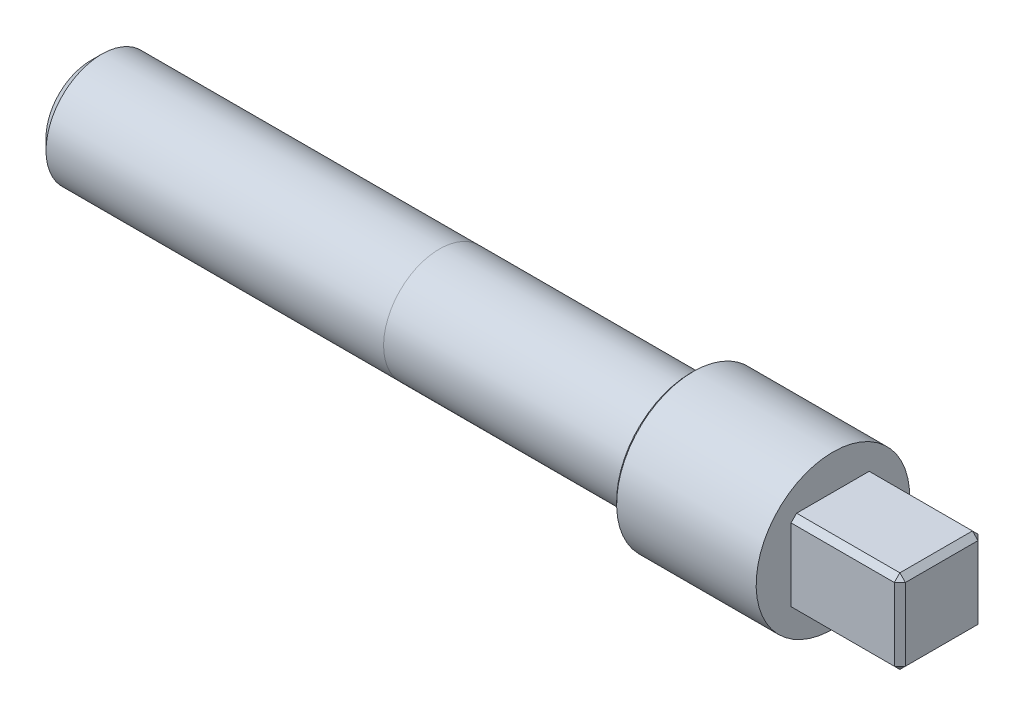
ISO-10303-21;
HEADER;
FILE_DESCRIPTION(('STEP AP214'),'2;1');
FILE_NAME('part.step','',(''),(''),'','','');
FILE_SCHEMA(('AUTOMOTIVE_DESIGN { 1 0 10303 214 1 1 1 1 }'));
ENDSEC;
DATA;
#1=APPLICATION_CONTEXT('core data for automotive mechanical design processes');
#2=APPLICATION_PROTOCOL_DEFINITION('international standard','automotive_design',2000,#1);
#3=PRODUCT_CONTEXT('',#1,'mechanical');
#4=PRODUCT('Part','Part','',(#3));
#5=PRODUCT_RELATED_PRODUCT_CATEGORY('part','',(#4));
#6=PRODUCT_DEFINITION_FORMATION('','',#4);
#7=PRODUCT_DEFINITION_CONTEXT('part definition',#1,'design');
#8=PRODUCT_DEFINITION('design','',#6,#7);
#9=PRODUCT_DEFINITION_SHAPE('','',#8);
#10=(LENGTH_UNIT() NAMED_UNIT(*) SI_UNIT(.MILLI.,.METRE.));
#11=(NAMED_UNIT(*) PLANE_ANGLE_UNIT() SI_UNIT($,.RADIAN.));
#12=(NAMED_UNIT(*) SI_UNIT($,.STERADIAN.) SOLID_ANGLE_UNIT());
#13=UNCERTAINTY_MEASURE_WITH_UNIT(LENGTH_MEASURE(1.E-05),#10,'distance_accuracy_value','');
#14=(GEOMETRIC_REPRESENTATION_CONTEXT(3) GLOBAL_UNCERTAINTY_ASSIGNED_CONTEXT((#13)) GLOBAL_UNIT_ASSIGNED_CONTEXT((#10,
#11,#12)) REPRESENTATION_CONTEXT('',''));
#15=CARTESIAN_POINT('',(0.,0.,0.));
#16=DIRECTION('',(0.,0.,1.));
#17=DIRECTION('',(1.,0.,0.));
#18=AXIS2_PLACEMENT_3D('',#15,#16,#17);
#19=CARTESIAN_POINT('',(215.,0.,0.));
#20=DIRECTION('',(-1.,0.,0.));
#21=DIRECTION('',(0.,0.,1.));
#22=AXIS2_PLACEMENT_3D('',#19,#20,#21);
#23=CYLINDRICAL_SURFACE('',#22,20.);
#24=CARTESIAN_POINT('',(215.,0.,0.));
#25=DIRECTION('',(1.,0.,0.));
#26=DIRECTION('',(0.,0.,-1.));
#27=AXIS2_PLACEMENT_3D('',#24,#25,#26);
#28=CIRCLE('',#27,20.);
#29=CARTESIAN_POINT('',(215.,0.,-20.));
#30=VERTEX_POINT('',#29);
#31=EDGE_CURVE('E145',#30,#30,#28,.T.);
#32=ORIENTED_EDGE('',*,*,#31,.F.);
#33=EDGE_LOOP('',(#32));
#34=FACE_BOUND('',#33,.T.);
#35=CARTESIAN_POINT('',(125.,0.,0.));
#36=DIRECTION('',(-1.,0.,0.));
#37=DIRECTION('',(0.,-1.,0.));
#38=AXIS2_PLACEMENT_3D('',#35,#36,#37);
#39=CIRCLE('',#38,20.);
#40=CARTESIAN_POINT('',(125.,-20.,0.));
#41=VERTEX_POINT('',#40);
#42=EDGE_CURVE('E191',#41,#41,#39,.T.);
#43=ORIENTED_EDGE('',*,*,#42,.F.);
#44=EDGE_LOOP('',(#43));
#45=FACE_BOUND('',#44,.T.);
#46=ADVANCED_FACE('F36',(#34,#45),#23,.T.);
#47=CARTESIAN_POINT('',(266.,0.,0.));
#48=DIRECTION('',(1.,0.,0.));
#49=DIRECTION('',(0.,1.,0.));
#50=AXIS2_PLACEMENT_3D('',#47,#48,#49);
#51=PLANE('',#50);
#52=CARTESIAN_POINT('',(266.,0.,0.));
#53=DIRECTION('',(1.,0.,0.));
#54=DIRECTION('',(0.,1.,0.));
#55=AXIS2_PLACEMENT_3D('',#52,#53,#54);
#56=CIRCLE('',#55,27.5);
#57=CARTESIAN_POINT('',(266.,27.5,0.));
#58=VERTEX_POINT('',#57);
#59=EDGE_CURVE('E141',#58,#58,#56,.T.);
#60=ORIENTED_EDGE('',*,*,#59,.T.);
#61=EDGE_LOOP('',(#60));
#62=FACE_BOUND('',#61,.T.);
#63=DIRECTION('',(0.,-1.,0.));
#64=VECTOR('',#63,1.);
#65=CARTESIAN_POINT('',(266.,15.,14.9999999999999));
#66=LINE('',#65,#64);
#67=CARTESIAN_POINT('',(266.,13.,14.9999999999999));
#68=VERTEX_POINT('',#67);
#69=CARTESIAN_POINT('',(266.,-13.,14.9999999999999));
#70=VERTEX_POINT('',#69);
#71=EDGE_CURVE('E147',#68,#70,#66,.T.);
#72=ORIENTED_EDGE('',*,*,#71,.F.);
#73=DIRECTION('',(0.,-0.707106781186548,0.707106781186548));
#74=VECTOR('',#73,1.);
#75=CARTESIAN_POINT('',(266.,13.,14.9999999999999));
#76=LINE('',#75,#74);
#77=CARTESIAN_POINT('',(266.,15.,12.9999999999999));
#78=VERTEX_POINT('',#77);
#79=EDGE_CURVE('E186',#68,#78,#76,.F.);
#80=ORIENTED_EDGE('',*,*,#79,.T.);
#81=DIRECTION('',(0.,0.,1.));
#82=VECTOR('',#81,1.);
#83=CARTESIAN_POINT('',(266.,15.,-15.0000000000001));
#84=LINE('',#83,#82);
#85=CARTESIAN_POINT('',(266.,15.,-13.0000000000001));
#86=VERTEX_POINT('',#85);
#87=EDGE_CURVE('E222',#86,#78,#84,.T.);
#88=ORIENTED_EDGE('',*,*,#87,.F.);
#89=DIRECTION('',(0.,0.707106781186548,0.707106781186548));
#90=VECTOR('',#89,1.);
#91=CARTESIAN_POINT('',(266.,15.,-13.0000000000001));
#92=LINE('',#91,#90);
#93=CARTESIAN_POINT('',(266.,13.,-15.0000000000001));
#94=VERTEX_POINT('',#93);
#95=EDGE_CURVE('E140',#86,#94,#92,.F.);
#96=ORIENTED_EDGE('',*,*,#95,.T.);
#97=DIRECTION('',(0.,1.,0.));
#98=VECTOR('',#97,1.);
#99=CARTESIAN_POINT('',(266.,15.,-15.0000000000001));
#100=LINE('',#99,#98);
#101=CARTESIAN_POINT('',(266.,-13.,-15.0000000000001));
#102=VERTEX_POINT('',#101);
#103=EDGE_CURVE('E129',#102,#94,#100,.T.);
#104=ORIENTED_EDGE('',*,*,#103,.F.);
#105=DIRECTION('',(0.,0.707106781186548,-0.707106781186548));
#106=VECTOR('',#105,1.);
#107=CARTESIAN_POINT('',(266.,-13.,-15.0000000000001));
#108=LINE('',#107,#106);
#109=CARTESIAN_POINT('',(266.,-15.,-13.0000000000001));
#110=VERTEX_POINT('',#109);
#111=EDGE_CURVE('E113',#102,#110,#108,.F.);
#112=ORIENTED_EDGE('',*,*,#111,.T.);
#113=DIRECTION('',(0.,0.,-1.));
#114=VECTOR('',#113,1.);
#115=CARTESIAN_POINT('',(266.,-15.,-15.0000000000001));
#116=LINE('',#115,#114);
#117=CARTESIAN_POINT('',(266.,-15.,12.9999999999999));
#118=VERTEX_POINT('',#117);
#119=EDGE_CURVE('E142',#118,#110,#116,.T.);
#120=ORIENTED_EDGE('',*,*,#119,.F.);
#121=DIRECTION('',(0.,-0.707106781186548,-0.707106781186547));
#122=VECTOR('',#121,1.);
#123=CARTESIAN_POINT('',(266.,-15.,12.9999999999999));
#124=LINE('',#123,#122);
#125=EDGE_CURVE('E123',#118,#70,#124,.F.);
#126=ORIENTED_EDGE('',*,*,#125,.T.);
#127=EDGE_LOOP('',(#72,#80,#88,#96,#104,#112,#120,#126));
#128=FACE_BOUND('',#127,.T.);
#129=ADVANCED_FACE('F137',(#62,#128),#51,.T.);
#130=CARTESIAN_POINT('',(215.,0.,0.));
#131=DIRECTION('',(1.,0.,0.));
#132=DIRECTION('',(0.,1.,0.));
#133=AXIS2_PLACEMENT_3D('',#130,#131,#132);
#134=PLANE('',#133);
#135=CARTESIAN_POINT('',(215.,0.,0.));
#136=DIRECTION('',(1.,0.,0.));
#137=DIRECTION('',(0.,1.,0.));
#138=AXIS2_PLACEMENT_3D('',#135,#136,#137);
#139=CIRCLE('',#138,26.5);
#140=CARTESIAN_POINT('',(215.,26.5,0.));
#141=VERTEX_POINT('',#140);
#142=EDGE_CURVE('E156',#141,#141,#139,.F.);
#143=ORIENTED_EDGE('',*,*,#142,.T.);
#144=EDGE_LOOP('',(#143));
#145=FACE_BOUND('',#144,.T.);
#146=ORIENTED_EDGE('',*,*,#31,.T.);
#147=EDGE_LOOP('',(#146));
#148=FACE_BOUND('',#147,.T.);
#149=ADVANCED_FACE('F242',(#145,#148),#134,.F.);
#150=CARTESIAN_POINT('',(266.,0.,0.));
#151=DIRECTION('',(-1.,0.,0.));
#152=DIRECTION('',(0.,-1.,0.));
#153=AXIS2_PLACEMENT_3D('',#150,#151,#152);
#154=CYLINDRICAL_SURFACE('',#153,27.5);
#155=CARTESIAN_POINT('',(216.,0.,0.));
#156=DIRECTION('',(1.,0.,0.));
#157=DIRECTION('',(0.,1.,0.));
#158=AXIS2_PLACEMENT_3D('',#155,#156,#157);
#159=CIRCLE('',#158,27.5);
#160=CARTESIAN_POINT('',(216.,27.5,0.));
#161=VERTEX_POINT('',#160);
#162=EDGE_CURVE('E153',#161,#161,#159,.T.);
#163=ORIENTED_EDGE('',*,*,#162,.T.);
#164=EDGE_LOOP('',(#163));
#165=FACE_BOUND('',#164,.T.);
#166=ORIENTED_EDGE('',*,*,#59,.F.);
#167=EDGE_LOOP('',(#166));
#168=FACE_BOUND('',#167,.T.);
#169=ADVANCED_FACE('F345',(#165,#168),#154,.T.);
#170=CARTESIAN_POINT('',(305.,15.,-15.0000000000001));
#171=DIRECTION('',(0.,-1.,0.));
#172=DIRECTION('',(1.,0.,0.));
#173=AXIS2_PLACEMENT_3D('',#170,#171,#172);
#174=PLANE('',#173);
#175=DIRECTION('',(0.,0.,-1.));
#176=VECTOR('',#175,1.);
#177=CARTESIAN_POINT('',(303.,15.,-15.0000000000001));
#178=LINE('',#177,#176);
#179=CARTESIAN_POINT('',(303.,15.,12.9999999999999));
#180=VERTEX_POINT('',#179);
#181=CARTESIAN_POINT('',(303.,15.,-13.0000000000001));
#182=VERTEX_POINT('',#181);
#183=EDGE_CURVE('E51',#180,#182,#178,.T.);
#184=ORIENTED_EDGE('',*,*,#183,.T.);
#185=DIRECTION('',(-1.,0.,0.));
#186=VECTOR('',#185,1.);
#187=CARTESIAN_POINT('',(305.,15.,-13.0000000000001));
#188=LINE('',#187,#186);
#189=EDGE_CURVE('E124',#182,#86,#188,.T.);
#190=ORIENTED_EDGE('',*,*,#189,.T.);
#191=ORIENTED_EDGE('',*,*,#87,.T.);
#192=DIRECTION('',(1.,0.,0.));
#193=VECTOR('',#192,1.);
#194=CARTESIAN_POINT('',(305.,15.,12.9999999999999));
#195=LINE('',#194,#193);
#196=EDGE_CURVE('E56',#78,#180,#195,.T.);
#197=ORIENTED_EDGE('',*,*,#196,.T.);
#198=EDGE_LOOP('',(#184,#190,#191,#197));
#199=FACE_BOUND('',#198,.T.);
#200=ADVANCED_FACE('F310',(#199),#174,.F.);
#201=CARTESIAN_POINT('',(305.,15.,14.9999999999999));
#202=DIRECTION('',(0.,0.,-1.));
#203=DIRECTION('',(-1.,0.,0.));
#204=AXIS2_PLACEMENT_3D('',#201,#202,#203);
#205=PLANE('',#204);
#206=ORIENTED_EDGE('',*,*,#71,.T.);
#207=DIRECTION('',(1.,0.,0.));
#208=VECTOR('',#207,1.);
#209=CARTESIAN_POINT('',(305.,-13.,14.9999999999999));
#210=LINE('',#209,#208);
#211=CARTESIAN_POINT('',(303.,-13.,14.9999999999999));
#212=VERTEX_POINT('',#211);
#213=EDGE_CURVE('E170',#70,#212,#210,.T.);
#214=ORIENTED_EDGE('',*,*,#213,.T.);
#215=DIRECTION('',(0.,1.,0.));
#216=VECTOR('',#215,1.);
#217=CARTESIAN_POINT('',(303.,15.,14.9999999999999));
#218=LINE('',#217,#216);
#219=CARTESIAN_POINT('',(303.,13.,14.9999999999999));
#220=VERTEX_POINT('',#219);
#221=EDGE_CURVE('E166',#212,#220,#218,.T.);
#222=ORIENTED_EDGE('',*,*,#221,.T.);
#223=DIRECTION('',(-1.,0.,0.));
#224=VECTOR('',#223,1.);
#225=CARTESIAN_POINT('',(305.,13.,14.9999999999999));
#226=LINE('',#225,#224);
#227=EDGE_CURVE('E168',#220,#68,#226,.T.);
#228=ORIENTED_EDGE('',*,*,#227,.T.);
#229=EDGE_LOOP('',(#206,#214,#222,#228));
#230=FACE_BOUND('',#229,.T.);
#231=ADVANCED_FACE('F339',(#230),#205,.F.);
#232=CARTESIAN_POINT('',(305.,-15.,-15.0000000000001));
#233=DIRECTION('',(0.,1.,0.));
#234=DIRECTION('',(-1.,0.,0.));
#235=AXIS2_PLACEMENT_3D('',#232,#233,#234);
#236=PLANE('',#235);
#237=ORIENTED_EDGE('',*,*,#119,.T.);
#238=DIRECTION('',(1.,0.,0.));
#239=VECTOR('',#238,1.);
#240=CARTESIAN_POINT('',(305.,-15.,-13.0000000000001));
#241=LINE('',#240,#239);
#242=CARTESIAN_POINT('',(303.,-15.,-13.0000000000001));
#243=VERTEX_POINT('',#242);
#244=EDGE_CURVE('E118',#110,#243,#241,.T.);
#245=ORIENTED_EDGE('',*,*,#244,.T.);
#246=DIRECTION('',(0.,0.,1.));
#247=VECTOR('',#246,1.);
#248=CARTESIAN_POINT('',(303.,-15.,14.9999999999999));
#249=LINE('',#248,#247);
#250=CARTESIAN_POINT('',(303.,-15.,12.9999999999999));
#251=VERTEX_POINT('',#250);
#252=EDGE_CURVE('E134',#243,#251,#249,.T.);
#253=ORIENTED_EDGE('',*,*,#252,.T.);
#254=DIRECTION('',(-1.,0.,0.));
#255=VECTOR('',#254,1.);
#256=CARTESIAN_POINT('',(305.,-15.,12.9999999999999));
#257=LINE('',#256,#255);
#258=EDGE_CURVE('E163',#251,#118,#257,.T.);
#259=ORIENTED_EDGE('',*,*,#258,.T.);
#260=EDGE_LOOP('',(#237,#245,#253,#259));
#261=FACE_BOUND('',#260,.T.);
#262=ADVANCED_FACE('F336',(#261),#236,.F.);
#263=CARTESIAN_POINT('',(305.,15.,-15.0000000000001));
#264=DIRECTION('',(0.,0.,1.));
#265=DIRECTION('',(1.,0.,0.));
#266=AXIS2_PLACEMENT_3D('',#263,#264,#265);
#267=PLANE('',#266);
#268=DIRECTION('',(0.,-1.,0.));
#269=VECTOR('',#268,1.);
#270=CARTESIAN_POINT('',(303.,-15.,-15.0000000000001));
#271=LINE('',#270,#269);
#272=CARTESIAN_POINT('',(303.,13.,-15.0000000000001));
#273=VERTEX_POINT('',#272);
#274=CARTESIAN_POINT('',(303.,-13.,-15.0000000000001));
#275=VERTEX_POINT('',#274);
#276=EDGE_CURVE('E132',#273,#275,#271,.T.);
#277=ORIENTED_EDGE('',*,*,#276,.T.);
#278=DIRECTION('',(-1.,0.,0.));
#279=VECTOR('',#278,1.);
#280=CARTESIAN_POINT('',(305.,-13.,-15.0000000000001));
#281=LINE('',#280,#279);
#282=EDGE_CURVE('E117',#275,#102,#281,.T.);
#283=ORIENTED_EDGE('',*,*,#282,.T.);
#284=ORIENTED_EDGE('',*,*,#103,.T.);
#285=DIRECTION('',(1.,0.,0.));
#286=VECTOR('',#285,1.);
#287=CARTESIAN_POINT('',(305.,13.,-15.0000000000001));
#288=LINE('',#287,#286);
#289=EDGE_CURVE('E159',#94,#273,#288,.T.);
#290=ORIENTED_EDGE('',*,*,#289,.T.);
#291=EDGE_LOOP('',(#277,#283,#284,#290));
#292=FACE_BOUND('',#291,.T.);
#293=ADVANCED_FACE('F128',(#292),#267,.F.);
#294=CARTESIAN_POINT('',(305.,0.,0.));
#295=DIRECTION('',(1.,0.,0.));
#296=DIRECTION('',(0.,0.,-1.));
#297=AXIS2_PLACEMENT_3D('',#294,#295,#296);
#298=PLANE('',#297);
#299=DIRECTION('',(0.,-1.,0.));
#300=VECTOR('',#299,1.);
#301=CARTESIAN_POINT('',(305.,-15.,12.9999999999999));
#302=LINE('',#301,#300);
#303=CARTESIAN_POINT('',(305.,13.,12.9999999999999));
#304=VERTEX_POINT('',#303);
#305=CARTESIAN_POINT('',(305.,-13.,12.9999999999999));
#306=VERTEX_POINT('',#305);
#307=EDGE_CURVE('E174',#304,#306,#302,.T.);
#308=ORIENTED_EDGE('',*,*,#307,.T.);
#309=DIRECTION('',(0.,0.,-1.));
#310=VECTOR('',#309,1.);
#311=CARTESIAN_POINT('',(305.,-13.,-15.0000000000001));
#312=LINE('',#311,#310);
#313=CARTESIAN_POINT('',(305.,-13.,-13.0000000000001));
#314=VERTEX_POINT('',#313);
#315=EDGE_CURVE('E178',#306,#314,#312,.T.);
#316=ORIENTED_EDGE('',*,*,#315,.T.);
#317=DIRECTION('',(0.,1.,0.));
#318=VECTOR('',#317,1.);
#319=CARTESIAN_POINT('',(305.,15.,-13.0000000000001));
#320=LINE('',#319,#318);
#321=CARTESIAN_POINT('',(305.,13.,-13.0000000000001));
#322=VERTEX_POINT('',#321);
#323=EDGE_CURVE('E176',#314,#322,#320,.T.);
#324=ORIENTED_EDGE('',*,*,#323,.T.);
#325=DIRECTION('',(0.,0.,1.));
#326=VECTOR('',#325,1.);
#327=CARTESIAN_POINT('',(305.,13.,14.9999999999999));
#328=LINE('',#327,#326);
#329=EDGE_CURVE('E172',#322,#304,#328,.T.);
#330=ORIENTED_EDGE('',*,*,#329,.T.);
#331=EDGE_LOOP('',(#308,#316,#324,#330));
#332=FACE_BOUND('',#331,.T.);
#333=ADVANCED_FACE('F253',(#332),#298,.T.);
#334=CARTESIAN_POINT('',(216.,0.,0.));
#335=DIRECTION('',(1.,0.,0.));
#336=DIRECTION('',(0.,1.,0.));
#337=AXIS2_PLACEMENT_3D('',#334,#335,#336);
#338=CONICAL_SURFACE('',#337,27.5,0.78539816339745);
#339=ORIENTED_EDGE('',*,*,#142,.F.);
#340=EDGE_LOOP('',(#339));
#341=FACE_BOUND('',#340,.T.);
#342=ORIENTED_EDGE('',*,*,#162,.F.);
#343=EDGE_LOOP('',(#342));
#344=FACE_BOUND('',#343,.T.);
#345=ADVANCED_FACE('F249',(#341,#344),#338,.T.);
#346=CARTESIAN_POINT('',(305.,13.,14.9999999999999));
#347=DIRECTION('',(0.,-0.707106781186547,-0.707106781186547));
#348=DIRECTION('',(-1.,0.,0.));
#349=AXIS2_PLACEMENT_3D('',#346,#347,#348);
#350=PLANE('',#349);
#351=DIRECTION('',(0.,0.707106781186547,-0.707106781186547));
#352=VECTOR('',#351,1.);
#353=CARTESIAN_POINT('',(303.,15.,12.9999999999999));
#354=LINE('',#353,#352);
#355=EDGE_CURVE('E220',#180,#220,#354,.F.);
#356=ORIENTED_EDGE('',*,*,#355,.F.);
#357=ORIENTED_EDGE('',*,*,#196,.F.);
#358=ORIENTED_EDGE('',*,*,#79,.F.);
#359=ORIENTED_EDGE('',*,*,#227,.F.);
#360=EDGE_LOOP('',(#356,#357,#358,#359));
#361=FACE_BOUND('',#360,.T.);
#362=ADVANCED_FACE('F252',(#361),#350,.F.);
#363=CARTESIAN_POINT('',(303.,15.,12.9999999999999));
#364=DIRECTION('',(0.577350269189626,0.577350269189626,0.577350269189626));
#365=DIRECTION('',(0.707106781186547,0.,-0.707106781186547));
#366=AXIS2_PLACEMENT_3D('',#363,#364,#365);
#367=PLANE('',#366);
#368=DIRECTION('',(-0.707106781186548,0.707106781186547,0.));
#369=VECTOR('',#368,1.);
#370=CARTESIAN_POINT('',(303.,15.,12.9999999999999));
#371=LINE('',#370,#369);
#372=EDGE_CURVE('E214',#180,#304,#371,.F.);
#373=ORIENTED_EDGE('',*,*,#372,.F.);
#374=ORIENTED_EDGE('',*,*,#355,.T.);
#375=DIRECTION('',(0.707106781186547,0.,-0.707106781186547));
#376=VECTOR('',#375,1.);
#377=CARTESIAN_POINT('',(304.,13.,13.9999999999999));
#378=LINE('',#377,#376);
#379=EDGE_CURVE('E217',#304,#220,#378,.F.);
#380=ORIENTED_EDGE('',*,*,#379,.F.);
#381=EDGE_LOOP('',(#373,#374,#380));
#382=FACE_BOUND('',#381,.T.);
#383=ADVANCED_FACE('F293',(#382),#367,.T.);
#384=CARTESIAN_POINT('',(305.,-15.,12.9999999999999));
#385=DIRECTION('',(0.,0.707106781186547,-0.707106781186548));
#386=DIRECTION('',(-1.,0.,0.));
#387=AXIS2_PLACEMENT_3D('',#384,#385,#386);
#388=PLANE('',#387);
#389=ORIENTED_EDGE('',*,*,#125,.F.);
#390=ORIENTED_EDGE('',*,*,#258,.F.);
#391=DIRECTION('',(0.,0.707106781186548,0.707106781186547));
#392=VECTOR('',#391,1.);
#393=CARTESIAN_POINT('',(303.,-13.,14.9999999999999));
#394=LINE('',#393,#392);
#395=EDGE_CURVE('E211',#212,#251,#394,.F.);
#396=ORIENTED_EDGE('',*,*,#395,.F.);
#397=ORIENTED_EDGE('',*,*,#213,.F.);
#398=EDGE_LOOP('',(#389,#390,#396,#397));
#399=FACE_BOUND('',#398,.T.);
#400=ADVANCED_FACE('F289',(#399),#388,.F.);
#401=CARTESIAN_POINT('',(305.,0.,12.9999999999999));
#402=DIRECTION('',(0.707106781186547,0.,0.707106781186547));
#403=DIRECTION('',(0.,1.,0.));
#404=AXIS2_PLACEMENT_3D('',#401,#402,#403);
#405=PLANE('',#404);
#406=ORIENTED_EDGE('',*,*,#379,.T.);
#407=ORIENTED_EDGE('',*,*,#221,.F.);
#408=DIRECTION('',(-0.707106781186547,0.,0.707106781186547));
#409=VECTOR('',#408,1.);
#410=CARTESIAN_POINT('',(303.,-13.,14.9999999999999));
#411=LINE('',#410,#409);
#412=EDGE_CURVE('E208',#306,#212,#411,.T.);
#413=ORIENTED_EDGE('',*,*,#412,.F.);
#414=ORIENTED_EDGE('',*,*,#307,.F.);
#415=EDGE_LOOP('',(#406,#407,#413,#414));
#416=FACE_BOUND('',#415,.T.);
#417=ADVANCED_FACE('F285',(#416),#405,.T.);
#418=CARTESIAN_POINT('',(305.,13.,0.));
#419=DIRECTION('',(0.707106781186547,0.707106781186548,0.));
#420=DIRECTION('',(0.,0.,-1.));
#421=AXIS2_PLACEMENT_3D('',#418,#419,#420);
#422=PLANE('',#421);
#423=ORIENTED_EDGE('',*,*,#372,.T.);
#424=ORIENTED_EDGE('',*,*,#329,.F.);
#425=DIRECTION('',(0.707106781186548,-0.707106781186547,0.));
#426=VECTOR('',#425,1.);
#427=CARTESIAN_POINT('',(305.,13.,-13.0000000000001));
#428=LINE('',#427,#426);
#429=EDGE_CURVE('E205',#182,#322,#428,.T.);
#430=ORIENTED_EDGE('',*,*,#429,.F.);
#431=ORIENTED_EDGE('',*,*,#183,.F.);
#432=EDGE_LOOP('',(#423,#424,#430,#431));
#433=FACE_BOUND('',#432,.T.);
#434=ADVANCED_FACE('F281',(#433),#422,.T.);
#435=CARTESIAN_POINT('',(305.,15.,-13.0000000000001));
#436=DIRECTION('',(0.,-0.707106781186547,0.707106781186547));
#437=DIRECTION('',(-1.,0.,0.));
#438=AXIS2_PLACEMENT_3D('',#435,#436,#437);
#439=PLANE('',#438);
#440=ORIENTED_EDGE('',*,*,#95,.F.);
#441=ORIENTED_EDGE('',*,*,#189,.F.);
#442=DIRECTION('',(0.,-0.707106781186547,-0.707106781186547));
#443=VECTOR('',#442,1.);
#444=CARTESIAN_POINT('',(303.,14.,-14.0000000000001));
#445=LINE('',#444,#443);
#446=EDGE_CURVE('E202',#273,#182,#445,.F.);
#447=ORIENTED_EDGE('',*,*,#446,.F.);
#448=ORIENTED_EDGE('',*,*,#289,.F.);
#449=EDGE_LOOP('',(#440,#441,#447,#448));
#450=FACE_BOUND('',#449,.T.);
#451=ADVANCED_FACE('F277',(#450),#439,.F.);
#452=CARTESIAN_POINT('',(303.,-13.,14.9999999999999));
#453=DIRECTION('',(0.577350269189625,-0.577350269189625,0.577350269189626));
#454=DIRECTION('',(0.707106781186548,0.,-0.707106781186547));
#455=AXIS2_PLACEMENT_3D('',#452,#453,#454);
#456=PLANE('',#455);
#457=ORIENTED_EDGE('',*,*,#412,.T.);
#458=ORIENTED_EDGE('',*,*,#395,.T.);
#459=DIRECTION('',(0.707106781186548,0.707106781186547,0.));
#460=VECTOR('',#459,1.);
#461=CARTESIAN_POINT('',(304.,-14.,12.9999999999999));
#462=LINE('',#461,#460);
#463=EDGE_CURVE('E199',#306,#251,#462,.F.);
#464=ORIENTED_EDGE('',*,*,#463,.F.);
#465=EDGE_LOOP('',(#457,#458,#464));
#466=FACE_BOUND('',#465,.T.);
#467=ADVANCED_FACE('F273',(#466),#456,.T.);
#468=CARTESIAN_POINT('',(305.,13.,-13.0000000000001));
#469=DIRECTION('',(0.577350269189626,0.577350269189626,-0.577350269189626));
#470=DIRECTION('',(-0.707106781186547,0.,-0.707106781186547));
#471=AXIS2_PLACEMENT_3D('',#468,#469,#470);
#472=PLANE('',#471);
#473=ORIENTED_EDGE('',*,*,#446,.T.);
#474=ORIENTED_EDGE('',*,*,#429,.T.);
#475=DIRECTION('',(-0.707106781186547,0.,-0.707106781186547));
#476=VECTOR('',#475,1.);
#477=CARTESIAN_POINT('',(305.,13.,-13.0000000000001));
#478=LINE('',#477,#476);
#479=EDGE_CURVE('E196',#273,#322,#478,.F.);
#480=ORIENTED_EDGE('',*,*,#479,.F.);
#481=EDGE_LOOP('',(#473,#474,#480));
#482=FACE_BOUND('',#481,.T.);
#483=ADVANCED_FACE('F269',(#482),#472,.T.);
#484=CARTESIAN_POINT('',(305.,-13.,0.));
#485=DIRECTION('',(0.707106781186547,-0.707106781186548,0.));
#486=DIRECTION('',(0.,0.,1.));
#487=AXIS2_PLACEMENT_3D('',#484,#485,#486);
#488=PLANE('',#487);
#489=ORIENTED_EDGE('',*,*,#463,.T.);
#490=ORIENTED_EDGE('',*,*,#252,.F.);
#491=DIRECTION('',(-0.707106781186548,-0.707106781186547,0.));
#492=VECTOR('',#491,1.);
#493=CARTESIAN_POINT('',(303.,-15.,-13.0000000000001));
#494=LINE('',#493,#492);
#495=EDGE_CURVE('E193',#314,#243,#494,.T.);
#496=ORIENTED_EDGE('',*,*,#495,.F.);
#497=ORIENTED_EDGE('',*,*,#315,.F.);
#498=EDGE_LOOP('',(#489,#490,#496,#497));
#499=FACE_BOUND('',#498,.T.);
#500=ADVANCED_FACE('F265',(#499),#488,.T.);
#501=CARTESIAN_POINT('',(305.,0.,-13.0000000000001));
#502=DIRECTION('',(0.707106781186547,0.,-0.707106781186547));
#503=DIRECTION('',(0.,-1.,0.));
#504=AXIS2_PLACEMENT_3D('',#501,#502,#503);
#505=PLANE('',#504);
#506=ORIENTED_EDGE('',*,*,#479,.T.);
#507=ORIENTED_EDGE('',*,*,#323,.F.);
#508=DIRECTION('',(0.707106781186547,0.,0.707106781186547));
#509=VECTOR('',#508,1.);
#510=CARTESIAN_POINT('',(304.,-13.,-14.0000000000001));
#511=LINE('',#510,#509);
#512=EDGE_CURVE('E190',#275,#314,#511,.T.);
#513=ORIENTED_EDGE('',*,*,#512,.F.);
#514=ORIENTED_EDGE('',*,*,#276,.F.);
#515=EDGE_LOOP('',(#506,#507,#513,#514));
#516=FACE_BOUND('',#515,.T.);
#517=ADVANCED_FACE('F261',(#516),#505,.T.);
#518=CARTESIAN_POINT('',(303.,-15.,-13.0000000000001));
#519=DIRECTION('',(0.577350269189626,-0.577350269189626,-0.577350269189626));
#520=DIRECTION('',(-0.707106781186547,0.,-0.707106781186547));
#521=AXIS2_PLACEMENT_3D('',#518,#519,#520);
#522=PLANE('',#521);
#523=ORIENTED_EDGE('',*,*,#512,.T.);
#524=ORIENTED_EDGE('',*,*,#495,.T.);
#525=DIRECTION('',(0.,-0.707106781186547,0.707106781186547));
#526=VECTOR('',#525,1.);
#527=CARTESIAN_POINT('',(303.,-15.,-13.0000000000001));
#528=LINE('',#527,#526);
#529=EDGE_CURVE('E188',#275,#243,#528,.T.);
#530=ORIENTED_EDGE('',*,*,#529,.F.);
#531=EDGE_LOOP('',(#523,#524,#530));
#532=FACE_BOUND('',#531,.T.);
#533=ADVANCED_FACE('F258',(#532),#522,.T.);
#534=CARTESIAN_POINT('',(305.,-13.,-15.0000000000001));
#535=DIRECTION('',(0.,0.707106781186547,0.707106781186547));
#536=DIRECTION('',(-1.,0.,0.));
#537=AXIS2_PLACEMENT_3D('',#534,#535,#536);
#538=PLANE('',#537);
#539=ORIENTED_EDGE('',*,*,#529,.T.);
#540=ORIENTED_EDGE('',*,*,#244,.F.);
#541=ORIENTED_EDGE('',*,*,#111,.F.);
#542=ORIENTED_EDGE('',*,*,#282,.F.);
#543=EDGE_LOOP('',(#539,#540,#541,#542));
#544=FACE_BOUND('',#543,.T.);
#545=ADVANCED_FACE('F116',(#544),#538,.F.);
#546=CARTESIAN_POINT('',(125.,0.,0.));
#547=DIRECTION('',(-1.,0.,0.));
#548=DIRECTION('',(0.,-1.,0.));
#549=AXIS2_PLACEMENT_3D('',#546,#547,#548);
#550=PLANE('',#549);
#551=CARTESIAN_POINT('',(125.,0.,0.));
#552=DIRECTION('',(-1.,0.,0.));
#553=DIRECTION('',(0.,-1.,0.));
#554=AXIS2_PLACEMENT_3D('',#551,#552,#553);
#555=CIRCLE('',#554,19.975);
#556=CARTESIAN_POINT('',(125.,-19.975,0.));
#557=VERTEX_POINT('',#556);
#558=EDGE_CURVE('E316',#557,#557,#555,.T.);
#559=ORIENTED_EDGE('',*,*,#558,.F.);
#560=EDGE_LOOP('',(#559));
#561=FACE_BOUND('',#560,.T.);
#562=ORIENTED_EDGE('',*,*,#42,.T.);
#563=EDGE_LOOP('',(#562));
#564=FACE_BOUND('',#563,.T.);
#565=ADVANCED_FACE('F257',(#561,#564),#550,.T.);
#566=CARTESIAN_POINT('',(125.,0.,0.));
#567=DIRECTION('',(-1.,0.,0.));
#568=DIRECTION('',(0.,-1.,0.));
#569=AXIS2_PLACEMENT_3D('',#566,#567,#568);
#570=CYLINDRICAL_SURFACE('',#569,19.975);
#571=CARTESIAN_POINT('',(3.99999999999999,0.,0.));
#572=DIRECTION('',(1.,0.,0.));
#573=DIRECTION('',(0.,1.,0.));
#574=AXIS2_PLACEMENT_3D('',#571,#572,#573);
#575=CIRCLE('',#574,19.975);
#576=CARTESIAN_POINT('',(3.99999999999999,19.975,0.));
#577=VERTEX_POINT('',#576);
#578=EDGE_CURVE('E11',#577,#577,#575,.T.);
#579=ORIENTED_EDGE('',*,*,#578,.T.);
#580=EDGE_LOOP('',(#579));
#581=FACE_BOUND('',#580,.T.);
#582=ORIENTED_EDGE('',*,*,#558,.T.);
#583=EDGE_LOOP('',(#582));
#584=FACE_BOUND('',#583,.T.);
#585=ADVANCED_FACE('F233',(#581,#584),#570,.T.);
#586=CARTESIAN_POINT('',(0.,0.,0.));
#587=DIRECTION('',(1.,0.,0.));
#588=DIRECTION('',(0.,0.,-1.));
#589=AXIS2_PLACEMENT_3D('',#586,#587,#588);
#590=PLANE('',#589);
#591=CARTESIAN_POINT('',(0.,0.,0.));
#592=DIRECTION('',(1.,0.,0.));
#593=DIRECTION('',(0.,0.,-1.));
#594=AXIS2_PLACEMENT_3D('',#591,#592,#593);
#595=CIRCLE('',#594,15.975);
#596=CARTESIAN_POINT('',(0.,0.,-15.975));
#597=VERTEX_POINT('',#596);
#598=EDGE_CURVE('E44',#597,#597,#595,.F.);
#599=ORIENTED_EDGE('',*,*,#598,.T.);
#600=EDGE_LOOP('',(#599));
#601=FACE_BOUND('',#600,.T.);
#602=ADVANCED_FACE('F226',(#601),#590,.F.);
#603=CARTESIAN_POINT('',(0.,0.,0.));
#604=DIRECTION('',(1.,0.,0.));
#605=DIRECTION('',(0.,1.,0.));
#606=AXIS2_PLACEMENT_3D('',#603,#604,#605);
#607=CONICAL_SURFACE('',#606,15.975,0.785398163397447);
#608=ORIENTED_EDGE('',*,*,#578,.F.);
#609=EDGE_LOOP('',(#608));
#610=FACE_BOUND('',#609,.T.);
#611=ORIENTED_EDGE('',*,*,#598,.F.);
#612=EDGE_LOOP('',(#611));
#613=FACE_BOUND('',#612,.T.);
#614=ADVANCED_FACE('F38',(#610,#613),#607,.T.);
#615=CLOSED_SHELL('',(#46,#129,#149,#169,#200,#231,#262,#293,#333,#345,#362,#383,#400,#417,#434,
#451,#467,#483,#500,#517,#533,#545,#565,#585,#602,#614));
#616=MANIFOLD_SOLID_BREP('B2',#615);
#617=ADVANCED_BREP_SHAPE_REPRESENTATION('',(#18,#616),#14);
#618=SHAPE_DEFINITION_REPRESENTATION(#9,#617);
ENDSEC;
END-ISO-10303-21;
